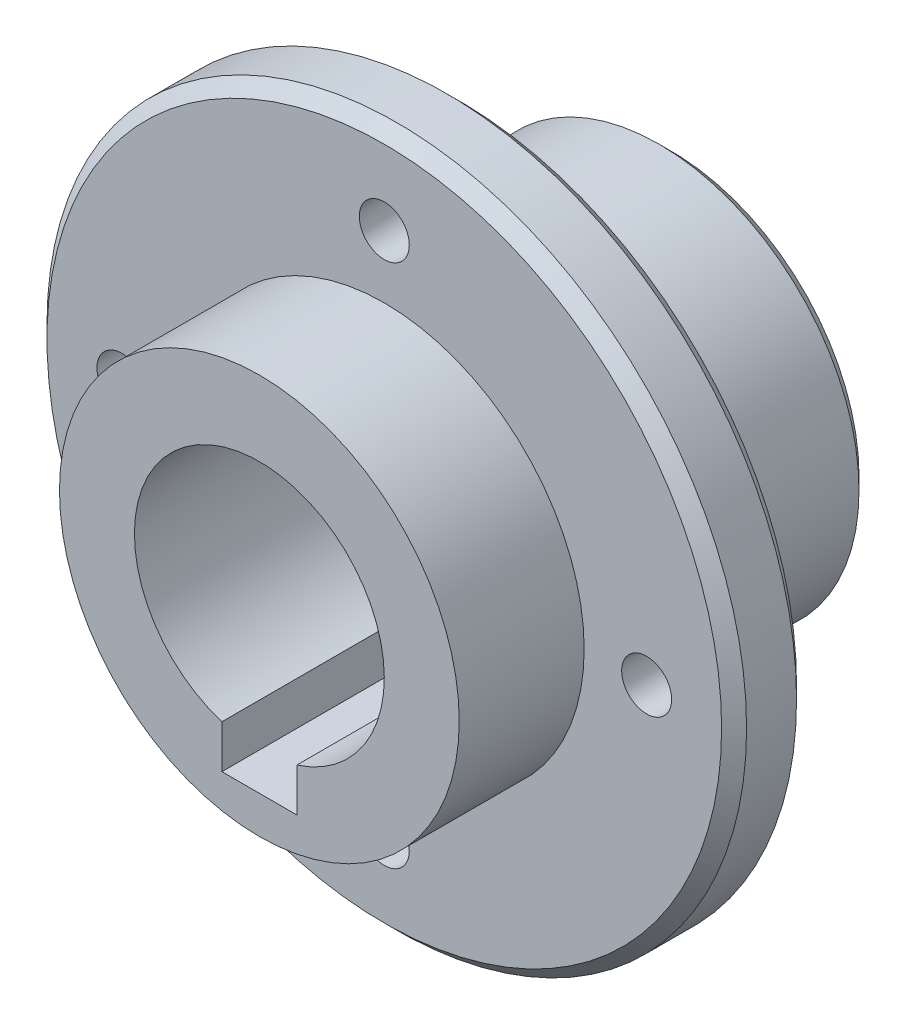
ISO-10303-21;
HEADER;
FILE_DESCRIPTION(('STEP AP214'),'2;1');
FILE_NAME('part.step','',(''),(''),'','','');
FILE_SCHEMA(('AUTOMOTIVE_DESIGN { 1 0 10303 214 1 1 1 1 }'));
ENDSEC;
DATA;
#1=APPLICATION_CONTEXT('core data for automotive mechanical design processes');
#2=APPLICATION_PROTOCOL_DEFINITION('international standard','automotive_design',2000,#1);
#3=PRODUCT_CONTEXT('',#1,'mechanical');
#4=PRODUCT('Part','Part','',(#3));
#5=PRODUCT_RELATED_PRODUCT_CATEGORY('part','',(#4));
#6=PRODUCT_DEFINITION_FORMATION('','',#4);
#7=PRODUCT_DEFINITION_CONTEXT('part definition',#1,'design');
#8=PRODUCT_DEFINITION('design','',#6,#7);
#9=PRODUCT_DEFINITION_SHAPE('','',#8);
#10=(LENGTH_UNIT() NAMED_UNIT(*) SI_UNIT(.MILLI.,.METRE.));
#11=(NAMED_UNIT(*) PLANE_ANGLE_UNIT() SI_UNIT($,.RADIAN.));
#12=(NAMED_UNIT(*) SI_UNIT($,.STERADIAN.) SOLID_ANGLE_UNIT());
#13=UNCERTAINTY_MEASURE_WITH_UNIT(LENGTH_MEASURE(1.E-05),#10,'distance_accuracy_value','');
#14=(GEOMETRIC_REPRESENTATION_CONTEXT(3) GLOBAL_UNCERTAINTY_ASSIGNED_CONTEXT((#13)) GLOBAL_UNIT_ASSIGNED_CONTEXT((#10,
#11,#12)) REPRESENTATION_CONTEXT('',''));
#15=CARTESIAN_POINT('',(0.,0.,0.));
#16=DIRECTION('',(0.,0.,1.));
#17=DIRECTION('',(1.,0.,0.));
#18=AXIS2_PLACEMENT_3D('',#15,#16,#17);
#19=CARTESIAN_POINT('',(0.,0.,23.));
#20=DIRECTION('',(0.,0.,1.));
#21=DIRECTION('',(1.,0.,0.));
#22=AXIS2_PLACEMENT_3D('',#19,#20,#21);
#23=PLANE('',#22);
#24=CARTESIAN_POINT('',(0.,21.,23.));
#25=DIRECTION('',(0.,0.,1.));
#26=DIRECTION('',(1.,0.,0.));
#27=AXIS2_PLACEMENT_3D('',#24,#25,#26);
#28=CIRCLE('',#27,2.);
#29=CARTESIAN_POINT('',(2.,21.,23.));
#30=VERTEX_POINT('',#29);
#31=EDGE_CURVE('E164',#30,#30,#28,.T.);
#32=ORIENTED_EDGE('',*,*,#31,.F.);
#33=EDGE_LOOP('',(#32));
#34=FACE_BOUND('',#33,.T.);
#35=CARTESIAN_POINT('',(21.,2.19963324347117E-13,23.));
#36=DIRECTION('',(0.,0.,1.));
#37=DIRECTION('',(1.,0.,0.));
#38=AXIS2_PLACEMENT_3D('',#35,#36,#37);
#39=CIRCLE('',#38,2.);
#40=CARTESIAN_POINT('',(23.,2.19963324347117E-13,23.));
#41=VERTEX_POINT('',#40);
#42=EDGE_CURVE('E139',#41,#41,#39,.T.);
#43=ORIENTED_EDGE('',*,*,#42,.F.);
#44=EDGE_LOOP('',(#43));
#45=FACE_BOUND('',#44,.T.);
#46=CARTESIAN_POINT('',(0.,-21.,23.));
#47=DIRECTION('',(0.,0.,1.));
#48=DIRECTION('',(1.,0.,0.));
#49=AXIS2_PLACEMENT_3D('',#46,#47,#48);
#50=CIRCLE('',#49,2.);
#51=CARTESIAN_POINT('',(2.,-21.,23.));
#52=VERTEX_POINT('',#51);
#53=EDGE_CURVE('E150',#52,#52,#50,.T.);
#54=ORIENTED_EDGE('',*,*,#53,.F.);
#55=EDGE_LOOP('',(#54));
#56=FACE_BOUND('',#55,.T.);
#57=CARTESIAN_POINT('',(-21.,0.,23.));
#58=DIRECTION('',(0.,0.,1.));
#59=DIRECTION('',(1.,0.,0.));
#60=AXIS2_PLACEMENT_3D('',#57,#58,#59);
#61=CIRCLE('',#60,2.);
#62=CARTESIAN_POINT('',(-19.,0.,23.));
#63=VERTEX_POINT('',#62);
#64=EDGE_CURVE('E154',#63,#63,#61,.T.);
#65=ORIENTED_EDGE('',*,*,#64,.F.);
#66=EDGE_LOOP('',(#65));
#67=FACE_BOUND('',#66,.T.);
#68=CARTESIAN_POINT('',(0.,0.,23.));
#69=DIRECTION('',(0.,0.,1.));
#70=DIRECTION('',(1.,0.,0.));
#71=AXIS2_PLACEMENT_3D('',#68,#69,#70);
#72=CIRCLE('',#71,27.);
#73=CARTESIAN_POINT('',(27.,0.,23.));
#74=VERTEX_POINT('',#73);
#75=EDGE_CURVE('E172',#74,#74,#72,.T.);
#76=ORIENTED_EDGE('',*,*,#75,.T.);
#77=EDGE_LOOP('',(#76));
#78=FACE_BOUND('',#77,.T.);
#79=CARTESIAN_POINT('',(0.,0.,23.));
#80=DIRECTION('',(0.,0.,1.));
#81=DIRECTION('',(1.,0.,0.));
#82=AXIS2_PLACEMENT_3D('',#79,#80,#81);
#83=CIRCLE('',#82,16.);
#84=CARTESIAN_POINT('',(16.,0.,23.));
#85=VERTEX_POINT('',#84);
#86=EDGE_CURVE('E126',#85,#85,#83,.T.);
#87=ORIENTED_EDGE('',*,*,#86,.F.);
#88=EDGE_LOOP('',(#87));
#89=FACE_BOUND('',#88,.T.);
#90=ADVANCED_FACE('F43',(#34,#45,#56,#67,#78,#89),#23,.T.);
#91=CARTESIAN_POINT('',(0.,0.,13.));
#92=DIRECTION('',(0.,0.,-1.));
#93=DIRECTION('',(-1.,0.,0.));
#94=AXIS2_PLACEMENT_3D('',#91,#92,#93);
#95=CYLINDRICAL_SURFACE('',#94,16.);
#96=CARTESIAN_POINT('',(0.,0.,1.00000000000004));
#97=DIRECTION('',(0.,0.,1.));
#98=DIRECTION('',(1.,0.,0.));
#99=AXIS2_PLACEMENT_3D('',#96,#97,#98);
#100=CIRCLE('',#99,16.);
#101=CARTESIAN_POINT('',(-16.,0.,1.00000000000004));
#102=VERTEX_POINT('',#101);
#103=EDGE_CURVE('E53',#102,#102,#100,.T.);
#104=CARTESIAN_POINT('',(0.,0.,17.));
#105=DIRECTION('',(0.,0.,1.));
#106=DIRECTION('',(1.,0.,0.));
#107=AXIS2_PLACEMENT_3D('',#104,#105,#106);
#108=CIRCLE('',#107,16.);
#109=CARTESIAN_POINT('',(-16.,0.,17.));
#110=VERTEX_POINT('',#109);
#111=EDGE_CURVE('E168',#110,#110,#108,.T.);
#112=CARTESIAN_POINT('',(-16.,0.,1.00000000000004));
#113=CARTESIAN_POINT('',(-16.,0.,1.16666666666671));
#114=CARTESIAN_POINT('',(-16.,0.,1.33333333333337));
#115=CARTESIAN_POINT('',(-16.,0.,1.6666666666667));
#116=CARTESIAN_POINT('',(-16.,0.,1.83333333333337));
#117=CARTESIAN_POINT('',(-16.,0.,2.1666666666667));
#118=CARTESIAN_POINT('',(-16.,0.,2.33333333333337));
#119=CARTESIAN_POINT('',(-16.,0.,2.6666666666667));
#120=CARTESIAN_POINT('',(-16.,0.,2.83333333333337));
#121=CARTESIAN_POINT('',(-16.,0.,3.1666666666667));
#122=CARTESIAN_POINT('',(-16.,0.,3.33333333333337));
#123=CARTESIAN_POINT('',(-16.,0.,3.6666666666667));
#124=CARTESIAN_POINT('',(-16.,0.,3.83333333333337));
#125=CARTESIAN_POINT('',(-16.,0.,4.1666666666667));
#126=CARTESIAN_POINT('',(-16.,0.,4.33333333333337));
#127=CARTESIAN_POINT('',(-16.,0.,4.6666666666667));
#128=CARTESIAN_POINT('',(-16.,0.,4.83333333333336));
#129=CARTESIAN_POINT('',(-16.,0.,5.1666666666667));
#130=CARTESIAN_POINT('',(-16.,0.,5.33333333333336));
#131=CARTESIAN_POINT('',(-16.,0.,5.66666666666669));
#132=CARTESIAN_POINT('',(-16.,0.,5.83333333333336));
#133=CARTESIAN_POINT('',(-16.,0.,6.16666666666669));
#134=CARTESIAN_POINT('',(-16.,0.,6.33333333333336));
#135=CARTESIAN_POINT('',(-16.,0.,6.66666666666669));
#136=CARTESIAN_POINT('',(-16.,0.,6.83333333333336));
#137=CARTESIAN_POINT('',(-16.,0.,7.16666666666669));
#138=CARTESIAN_POINT('',(-16.,0.,7.33333333333336));
#139=CARTESIAN_POINT('',(-16.,0.,7.66666666666669));
#140=CARTESIAN_POINT('',(-16.,0.,7.83333333333336));
#141=CARTESIAN_POINT('',(-16.,0.,8.16666666666669));
#142=CARTESIAN_POINT('',(-16.,0.,8.33333333333335));
#143=CARTESIAN_POINT('',(-16.,0.,8.66666666666669));
#144=CARTESIAN_POINT('',(-16.,0.,8.83333333333335));
#145=CARTESIAN_POINT('',(-16.,0.,9.16666666666668));
#146=CARTESIAN_POINT('',(-16.,0.,9.33333333333335));
#147=CARTESIAN_POINT('',(-16.,0.,9.66666666666668));
#148=CARTESIAN_POINT('',(-16.,0.,9.83333333333335));
#149=CARTESIAN_POINT('',(-16.,0.,10.1666666666667));
#150=CARTESIAN_POINT('',(-16.,0.,10.3333333333333));
#151=CARTESIAN_POINT('',(-16.,0.,10.6666666666667));
#152=CARTESIAN_POINT('',(-16.,0.,10.8333333333333));
#153=CARTESIAN_POINT('',(-16.,0.,11.1666666666667));
#154=CARTESIAN_POINT('',(-16.,0.,11.3333333333333));
#155=CARTESIAN_POINT('',(-16.,0.,11.6666666666667));
#156=CARTESIAN_POINT('',(-16.,0.,11.8333333333333));
#157=CARTESIAN_POINT('',(-16.,0.,12.1666666666667));
#158=CARTESIAN_POINT('',(-16.,0.,12.3333333333333));
#159=CARTESIAN_POINT('',(-16.,0.,12.6666666666667));
#160=CARTESIAN_POINT('',(-16.,0.,12.8333333333333));
#161=CARTESIAN_POINT('',(-16.,0.,13.1666666666667));
#162=CARTESIAN_POINT('',(-16.,0.,13.3333333333333));
#163=CARTESIAN_POINT('',(-16.,0.,13.6666666666667));
#164=CARTESIAN_POINT('',(-16.,0.,13.8333333333333));
#165=CARTESIAN_POINT('',(-16.,0.,14.1666666666667));
#166=CARTESIAN_POINT('',(-16.,0.,14.3333333333333));
#167=CARTESIAN_POINT('',(-16.,0.,14.6666666666667));
#168=CARTESIAN_POINT('',(-16.,0.,14.8333333333333));
#169=CARTESIAN_POINT('',(-16.,0.,15.1666666666667));
#170=CARTESIAN_POINT('',(-16.,0.,15.3333333333333));
#171=CARTESIAN_POINT('',(-16.,0.,15.6666666666667));
#172=CARTESIAN_POINT('',(-16.,0.,15.8333333333333));
#173=CARTESIAN_POINT('',(-16.,0.,16.1666666666667));
#174=CARTESIAN_POINT('',(-16.,0.,16.3333333333333));
#175=CARTESIAN_POINT('',(-16.,0.,16.6666666666667));
#176=CARTESIAN_POINT('',(-16.,0.,16.8333333333333));
#177=CARTESIAN_POINT('',(-16.,0.,17.));
#178=B_SPLINE_CURVE_WITH_KNOTS('',3,(#112,#113,#114,#115,#116,#117,#118,#119,#120,#121,#122,
#123,#124,#125,#126,#127,#128,#129,#130,#131,#132,#133,#134,#135,#136,#137,#138,#139,#140,#141,
#142,#143,#144,#145,#146,#147,#148,#149,#150,#151,#152,#153,#154,#155,#156,#157,#158,#159,#160,
#161,#162,#163,#164,#165,#166,#167,#168,#169,#170,#171,#172,#173,#174,#175,#176,#177),
.UNSPECIFIED.,.F.,.F.,(4,2,2,2,2,2,2,2,2,2,2,2,2,2,2,2,2,2,2,2,2,2,2,2,2,2,2,2,2,2,2,2,4),(0.,
0.499999999999999,0.999999999999997,1.5,1.99999999999999,2.49999999999999,2.99999999999999,
3.49999999999999,3.99999999999999,4.49999999999999,4.99999999999999,5.49999999999999,
5.99999999999999,6.49999999999998,6.99999999999998,7.49999999999998,7.99999999999998,
8.49999999999998,8.99999999999998,9.49999999999998,9.99999999999997,10.5,11.,11.5,12.,12.5,13.,
13.5,14.,14.5,15.,15.5,16.),.UNSPECIFIED.);
#179=EDGE_CURVE('BSEAM191',#102,#110,#178,.T.);
#180=ORIENTED_EDGE('',*,*,#103,.T.);
#181=ORIENTED_EDGE('',*,*,#111,.F.);
#182=ORIENTED_EDGE('',*,*,#179,.T.);
#183=ORIENTED_EDGE('',*,*,#179,.F.);
#184=EDGE_LOOP('',(#180,#182,#181,#183));
#185=FACE_BOUND('',#184,.T.);
#186=ADVANCED_FACE('F191',(#185),#95,.T.);
#187=CARTESIAN_POINT('',(0.,0.,0.));
#188=DIRECTION('',(0.,0.,1.));
#189=DIRECTION('',(1.,0.,0.));
#190=AXIS2_PLACEMENT_3D('',#187,#188,#189);
#191=PLANE('',#190);
#192=CARTESIAN_POINT('',(0.,0.,0.));
#193=DIRECTION('',(0.,0.,1.));
#194=DIRECTION('',(1.,0.,0.));
#195=AXIS2_PLACEMENT_3D('',#192,#193,#194);
#196=CIRCLE('',#195,15.);
#197=CARTESIAN_POINT('',(15.,0.,0.));
#198=VERTEX_POINT('',#197);
#199=EDGE_CURVE('E11',#198,#198,#196,.F.);
#200=ORIENTED_EDGE('',*,*,#199,.T.);
#201=EDGE_LOOP('',(#200));
#202=FACE_BOUND('',#201,.T.);
#203=DIRECTION('',(-1.,0.,0.));
#204=VECTOR('',#203,1.);
#205=CARTESIAN_POINT('',(0.,-13.,0.));
#206=LINE('',#205,#204);
#207=CARTESIAN_POINT('',(3.,-13.,0.));
#208=VERTEX_POINT('',#207);
#209=CARTESIAN_POINT('',(-3.,-13.,0.));
#210=VERTEX_POINT('',#209);
#211=EDGE_CURVE('E85',#208,#210,#206,.T.);
#212=ORIENTED_EDGE('',*,*,#211,.F.);
#213=DIRECTION('',(0.,1.,0.));
#214=VECTOR('',#213,1.);
#215=CARTESIAN_POINT('',(3.,-13.,0.));
#216=LINE('',#215,#214);
#217=CARTESIAN_POINT('',(3.,-9.53939201416946,0.));
#218=VERTEX_POINT('',#217);
#219=EDGE_CURVE('E119',#208,#218,#216,.T.);
#220=ORIENTED_EDGE('',*,*,#219,.T.);
#221=CARTESIAN_POINT('',(0.,0.,0.));
#222=DIRECTION('',(0.,0.,-1.));
#223=DIRECTION('',(-1.,0.,0.));
#224=AXIS2_PLACEMENT_3D('',#221,#222,#223);
#225=CIRCLE('',#224,10.);
#226=CARTESIAN_POINT('',(-3.,-9.53939201416946,0.));
#227=VERTEX_POINT('',#226);
#228=EDGE_CURVE('E106',#227,#218,#225,.T.);
#229=ORIENTED_EDGE('',*,*,#228,.F.);
#230=DIRECTION('',(0.,1.,0.));
#231=VECTOR('',#230,1.);
#232=CARTESIAN_POINT('',(-3.,-13.,0.));
#233=LINE('',#232,#231);
#234=EDGE_CURVE('E95',#210,#227,#233,.T.);
#235=ORIENTED_EDGE('',*,*,#234,.F.);
#236=EDGE_LOOP('',(#212,#220,#229,#235));
#237=FACE_BOUND('',#236,.T.);
#238=ADVANCED_FACE('F104',(#202,#237),#191,.F.);
#239=CARTESIAN_POINT('',(0.,0.,23.));
#240=DIRECTION('',(0.,0.,-1.));
#241=DIRECTION('',(-1.,0.,0.));
#242=AXIS2_PLACEMENT_3D('',#239,#240,#241);
#243=CYLINDRICAL_SURFACE('',#242,28.);
#244=CARTESIAN_POINT('',(0.,0.,18.));
#245=DIRECTION('',(0.,0.,1.));
#246=DIRECTION('',(1.,0.,0.));
#247=AXIS2_PLACEMENT_3D('',#244,#245,#246);
#248=CIRCLE('',#247,28.);
#249=CARTESIAN_POINT('',(28.,0.,18.));
#250=VERTEX_POINT('',#249);
#251=EDGE_CURVE('E180',#250,#250,#248,.T.);
#252=ORIENTED_EDGE('',*,*,#251,.T.);
#253=EDGE_LOOP('',(#252));
#254=FACE_BOUND('',#253,.T.);
#255=CARTESIAN_POINT('',(0.,0.,22.));
#256=DIRECTION('',(0.,0.,1.));
#257=DIRECTION('',(1.,0.,0.));
#258=AXIS2_PLACEMENT_3D('',#255,#256,#257);
#259=CIRCLE('',#258,28.);
#260=CARTESIAN_POINT('',(28.,0.,22.));
#261=VERTEX_POINT('',#260);
#262=EDGE_CURVE('E176',#261,#261,#259,.F.);
#263=ORIENTED_EDGE('',*,*,#262,.T.);
#264=EDGE_LOOP('',(#263));
#265=FACE_BOUND('',#264,.T.);
#266=ADVANCED_FACE('F224',(#254,#265),#243,.T.);
#267=CARTESIAN_POINT('',(0.,0.,17.));
#268=DIRECTION('',(0.,0.,1.));
#269=DIRECTION('',(1.,0.,0.));
#270=AXIS2_PLACEMENT_3D('',#267,#268,#269);
#271=PLANE('',#270);
#272=CARTESIAN_POINT('',(0.,0.,17.));
#273=DIRECTION('',(0.,0.,1.));
#274=DIRECTION('',(1.,0.,0.));
#275=AXIS2_PLACEMENT_3D('',#272,#273,#274);
#276=CIRCLE('',#275,27.);
#277=CARTESIAN_POINT('',(27.,0.,17.));
#278=VERTEX_POINT('',#277);
#279=EDGE_CURVE('E184',#278,#278,#276,.F.);
#280=ORIENTED_EDGE('',*,*,#279,.T.);
#281=EDGE_LOOP('',(#280));
#282=FACE_BOUND('',#281,.T.);
#283=CARTESIAN_POINT('',(-21.,0.,17.));
#284=DIRECTION('',(0.,0.,-1.));
#285=DIRECTION('',(0.,-1.,0.));
#286=AXIS2_PLACEMENT_3D('',#283,#284,#285);
#287=CIRCLE('',#286,2.);
#288=CARTESIAN_POINT('',(-21.,-2.00000000000008,17.));
#289=VERTEX_POINT('',#288);
#290=EDGE_CURVE('E135',#289,#289,#287,.T.);
#291=ORIENTED_EDGE('',*,*,#290,.F.);
#292=EDGE_LOOP('',(#291));
#293=FACE_BOUND('',#292,.T.);
#294=CARTESIAN_POINT('',(0.,-21.,17.));
#295=DIRECTION('',(0.,0.,-1.));
#296=DIRECTION('',(1.,0.,0.));
#297=AXIS2_PLACEMENT_3D('',#294,#295,#296);
#298=CIRCLE('',#297,2.);
#299=CARTESIAN_POINT('',(2.,-21.,17.));
#300=VERTEX_POINT('',#299);
#301=EDGE_CURVE('E140',#300,#300,#298,.T.);
#302=ORIENTED_EDGE('',*,*,#301,.F.);
#303=EDGE_LOOP('',(#302));
#304=FACE_BOUND('',#303,.T.);
#305=CARTESIAN_POINT('',(21.,2.19963324347117E-13,17.));
#306=DIRECTION('',(0.,0.,-1.));
#307=DIRECTION('',(0.,1.,0.));
#308=AXIS2_PLACEMENT_3D('',#305,#306,#307);
#309=CIRCLE('',#308,2.);
#310=CARTESIAN_POINT('',(21.,2.00000000000022,17.));
#311=VERTEX_POINT('',#310);
#312=EDGE_CURVE('E131',#311,#311,#309,.T.);
#313=ORIENTED_EDGE('',*,*,#312,.F.);
#314=EDGE_LOOP('',(#313));
#315=FACE_BOUND('',#314,.T.);
#316=CARTESIAN_POINT('',(0.,21.,17.));
#317=DIRECTION('',(0.,0.,-1.));
#318=DIRECTION('',(-1.,0.,0.));
#319=AXIS2_PLACEMENT_3D('',#316,#317,#318);
#320=CIRCLE('',#319,2.);
#321=CARTESIAN_POINT('',(-2.,21.,17.));
#322=VERTEX_POINT('',#321);
#323=EDGE_CURVE('E160',#322,#322,#320,.T.);
#324=ORIENTED_EDGE('',*,*,#323,.F.);
#325=EDGE_LOOP('',(#324));
#326=FACE_BOUND('',#325,.T.);
#327=ORIENTED_EDGE('',*,*,#111,.T.);
#328=EDGE_LOOP('',(#327));
#329=FACE_BOUND('',#328,.T.);
#330=ADVANCED_FACE('F221',(#282,#293,#304,#315,#326,#329),#271,.F.);
#331=CARTESIAN_POINT('',(0.,21.,27.));
#332=DIRECTION('',(0.,0.,-1.));
#333=DIRECTION('',(-1.,0.,0.));
#334=AXIS2_PLACEMENT_3D('',#331,#332,#333);
#335=CYLINDRICAL_SURFACE('',#334,2.);
#336=ORIENTED_EDGE('',*,*,#31,.T.);
#337=EDGE_LOOP('',(#336));
#338=FACE_BOUND('',#337,.T.);
#339=ORIENTED_EDGE('',*,*,#323,.T.);
#340=EDGE_LOOP('',(#339));
#341=FACE_BOUND('',#340,.T.);
#342=ADVANCED_FACE('F219',(#338,#341),#335,.F.);
#343=CARTESIAN_POINT('',(0.,0.,60.));
#344=DIRECTION('',(0.,0.,-1.));
#345=DIRECTION('',(-1.,0.,0.));
#346=AXIS2_PLACEMENT_3D('',#343,#344,#345);
#347=CYLINDRICAL_SURFACE('',#346,10.);
#348=ORIENTED_EDGE('',*,*,#228,.T.);
#349=DIRECTION('',(0.,0.,-1.));
#350=VECTOR('',#349,1.);
#351=CARTESIAN_POINT('',(3.,-9.53939201416945,60.));
#352=LINE('',#351,#350);
#353=CARTESIAN_POINT('',(3.,-9.53939201416946,33.));
#354=VERTEX_POINT('',#353);
#355=EDGE_CURVE('E68',#218,#354,#352,.F.);
#356=ORIENTED_EDGE('',*,*,#355,.T.);
#357=CARTESIAN_POINT('',(0.,0.,33.));
#358=DIRECTION('',(0.,0.,1.));
#359=DIRECTION('',(1.,0.,0.));
#360=AXIS2_PLACEMENT_3D('',#357,#358,#359);
#361=CIRCLE('',#360,10.);
#362=CARTESIAN_POINT('',(-3.,-9.53939201416946,33.));
#363=VERTEX_POINT('',#362);
#364=EDGE_CURVE('E122',#354,#363,#361,.T.);
#365=ORIENTED_EDGE('',*,*,#364,.T.);
#366=DIRECTION('',(0.,0.,-1.));
#367=VECTOR('',#366,1.);
#368=CARTESIAN_POINT('',(-2.99999999999999,-9.53939201416946,60.));
#369=LINE('',#368,#367);
#370=EDGE_CURVE('E116',#363,#227,#369,.T.);
#371=ORIENTED_EDGE('',*,*,#370,.T.);
#372=EDGE_LOOP('',(#348,#356,#365,#371));
#373=FACE_BOUND('',#372,.T.);
#374=ADVANCED_FACE('F272',(#373),#347,.F.);
#375=CARTESIAN_POINT('',(21.,2.19963324347117E-13,27.));
#376=DIRECTION('',(0.,0.,-1.));
#377=DIRECTION('',(-1.,0.,0.));
#378=AXIS2_PLACEMENT_3D('',#375,#376,#377);
#379=CYLINDRICAL_SURFACE('',#378,2.);
#380=ORIENTED_EDGE('',*,*,#42,.T.);
#381=EDGE_LOOP('',(#380));
#382=FACE_BOUND('',#381,.T.);
#383=ORIENTED_EDGE('',*,*,#312,.T.);
#384=EDGE_LOOP('',(#383));
#385=FACE_BOUND('',#384,.T.);
#386=ADVANCED_FACE('F269',(#382,#385),#379,.F.);
#387=CARTESIAN_POINT('',(0.,-21.,27.));
#388=DIRECTION('',(0.,0.,-1.));
#389=DIRECTION('',(-1.,0.,0.));
#390=AXIS2_PLACEMENT_3D('',#387,#388,#389);
#391=CYLINDRICAL_SURFACE('',#390,2.);
#392=ORIENTED_EDGE('',*,*,#53,.T.);
#393=EDGE_LOOP('',(#392));
#394=FACE_BOUND('',#393,.T.);
#395=ORIENTED_EDGE('',*,*,#301,.T.);
#396=EDGE_LOOP('',(#395));
#397=FACE_BOUND('',#396,.T.);
#398=ADVANCED_FACE('F246',(#394,#397),#391,.F.);
#399=CARTESIAN_POINT('',(-21.,0.,27.));
#400=DIRECTION('',(0.,0.,-1.));
#401=DIRECTION('',(-1.,0.,0.));
#402=AXIS2_PLACEMENT_3D('',#399,#400,#401);
#403=CYLINDRICAL_SURFACE('',#402,2.);
#404=ORIENTED_EDGE('',*,*,#64,.T.);
#405=EDGE_LOOP('',(#404));
#406=FACE_BOUND('',#405,.T.);
#407=ORIENTED_EDGE('',*,*,#290,.T.);
#408=EDGE_LOOP('',(#407));
#409=FACE_BOUND('',#408,.T.);
#410=ADVANCED_FACE('F237',(#406,#409),#403,.F.);
#411=CARTESIAN_POINT('',(0.,0.,23.));
#412=DIRECTION('',(0.,0.,-1.));
#413=DIRECTION('',(-1.,0.,0.));
#414=AXIS2_PLACEMENT_3D('',#411,#412,#413);
#415=CONICAL_SURFACE('',#414,27.,0.785398163397452);
#416=ORIENTED_EDGE('',*,*,#262,.F.);
#417=EDGE_LOOP('',(#416));
#418=FACE_BOUND('',#417,.T.);
#419=ORIENTED_EDGE('',*,*,#75,.F.);
#420=EDGE_LOOP('',(#419));
#421=FACE_BOUND('',#420,.T.);
#422=ADVANCED_FACE('F205',(#418,#421),#415,.T.);
#423=CARTESIAN_POINT('',(0.,0.,18.));
#424=DIRECTION('',(0.,0.,1.));
#425=DIRECTION('',(1.,0.,0.));
#426=AXIS2_PLACEMENT_3D('',#423,#424,#425);
#427=CONICAL_SURFACE('',#426,28.,0.785398163397452);
#428=ORIENTED_EDGE('',*,*,#279,.F.);
#429=EDGE_LOOP('',(#428));
#430=FACE_BOUND('',#429,.T.);
#431=ORIENTED_EDGE('',*,*,#251,.F.);
#432=EDGE_LOOP('',(#431));
#433=FACE_BOUND('',#432,.T.);
#434=ADVANCED_FACE('F196',(#430,#433),#427,.T.);
#435=CARTESIAN_POINT('',(0.,0.,1.00000000000004));
#436=DIRECTION('',(0.,0.,1.));
#437=DIRECTION('',(1.,0.,0.));
#438=AXIS2_PLACEMENT_3D('',#435,#436,#437);
#439=CONICAL_SURFACE('',#438,16.,0.785398163397452);
#440=ORIENTED_EDGE('',*,*,#199,.F.);
#441=EDGE_LOOP('',(#440));
#442=FACE_BOUND('',#441,.T.);
#443=ORIENTED_EDGE('',*,*,#103,.F.);
#444=EDGE_LOOP('',(#443));
#445=FACE_BOUND('',#444,.T.);
#446=ADVANCED_FACE('F46',(#442,#445),#439,.T.);
#447=CARTESIAN_POINT('',(0.,0.,33.));
#448=DIRECTION('',(0.,0.,1.));
#449=DIRECTION('',(1.,0.,0.));
#450=AXIS2_PLACEMENT_3D('',#447,#448,#449);
#451=PLANE('',#450);
#452=DIRECTION('',(0.,1.,0.));
#453=VECTOR('',#452,1.);
#454=CARTESIAN_POINT('',(3.,-13.,33.));
#455=LINE('',#454,#453);
#456=CARTESIAN_POINT('',(3.,-13.,33.));
#457=VERTEX_POINT('',#456);
#458=EDGE_CURVE('E111',#457,#354,#455,.T.);
#459=ORIENTED_EDGE('',*,*,#458,.F.);
#460=DIRECTION('',(1.,0.,0.));
#461=VECTOR('',#460,1.);
#462=CARTESIAN_POINT('',(3.,-13.,33.));
#463=LINE('',#462,#461);
#464=CARTESIAN_POINT('',(-3.,-13.,33.));
#465=VERTEX_POINT('',#464);
#466=EDGE_CURVE('E101',#465,#457,#463,.T.);
#467=ORIENTED_EDGE('',*,*,#466,.F.);
#468=DIRECTION('',(0.,1.,0.));
#469=VECTOR('',#468,1.);
#470=CARTESIAN_POINT('',(-3.,-13.,33.));
#471=LINE('',#470,#469);
#472=EDGE_CURVE('E98',#465,#363,#471,.T.);
#473=ORIENTED_EDGE('',*,*,#472,.T.);
#474=ORIENTED_EDGE('',*,*,#364,.F.);
#475=EDGE_LOOP('',(#459,#467,#473,#474));
#476=FACE_BOUND('',#475,.T.);
#477=CARTESIAN_POINT('',(0.,0.,33.));
#478=DIRECTION('',(0.,0.,1.));
#479=DIRECTION('',(1.,0.,0.));
#480=AXIS2_PLACEMENT_3D('',#477,#478,#479);
#481=CIRCLE('',#480,16.);
#482=CARTESIAN_POINT('',(16.,0.,33.));
#483=VERTEX_POINT('',#482);
#484=EDGE_CURVE('E127',#483,#483,#481,.T.);
#485=ORIENTED_EDGE('',*,*,#484,.T.);
#486=EDGE_LOOP('',(#485));
#487=FACE_BOUND('',#486,.T.);
#488=ADVANCED_FACE('F195',(#476,#487),#451,.T.);
#489=CARTESIAN_POINT('',(0.,0.,33.));
#490=DIRECTION('',(0.,0.,-1.));
#491=DIRECTION('',(-1.,0.,0.));
#492=AXIS2_PLACEMENT_3D('',#489,#490,#491);
#493=CYLINDRICAL_SURFACE('',#492,16.);
#494=ORIENTED_EDGE('',*,*,#484,.F.);
#495=EDGE_LOOP('',(#494));
#496=FACE_BOUND('',#495,.T.);
#497=ORIENTED_EDGE('',*,*,#86,.T.);
#498=EDGE_LOOP('',(#497));
#499=FACE_BOUND('',#498,.T.);
#500=ADVANCED_FACE('F202',(#496,#499),#493,.T.);
#501=CARTESIAN_POINT('',(3.,-13.,0.));
#502=DIRECTION('',(1.,0.,0.));
#503=DIRECTION('',(0.,0.,-1.));
#504=AXIS2_PLACEMENT_3D('',#501,#502,#503);
#505=PLANE('',#504);
#506=ORIENTED_EDGE('',*,*,#219,.F.);
#507=DIRECTION('',(0.,0.,-1.));
#508=VECTOR('',#507,1.);
#509=CARTESIAN_POINT('',(3.,-13.,0.));
#510=LINE('',#509,#508);
#511=EDGE_CURVE('E88',#457,#208,#510,.T.);
#512=ORIENTED_EDGE('',*,*,#511,.F.);
#513=ORIENTED_EDGE('',*,*,#458,.T.);
#514=ORIENTED_EDGE('',*,*,#355,.F.);
#515=EDGE_LOOP('',(#506,#512,#513,#514));
#516=FACE_BOUND('',#515,.T.);
#517=ADVANCED_FACE('F257',(#516),#505,.F.);
#518=CARTESIAN_POINT('',(-3.,-13.,0.));
#519=DIRECTION('',(-1.,0.,0.));
#520=DIRECTION('',(0.,0.,1.));
#521=AXIS2_PLACEMENT_3D('',#518,#519,#520);
#522=PLANE('',#521);
#523=ORIENTED_EDGE('',*,*,#472,.F.);
#524=DIRECTION('',(0.,0.,1.));
#525=VECTOR('',#524,1.);
#526=CARTESIAN_POINT('',(-3.,-13.,0.));
#527=LINE('',#526,#525);
#528=EDGE_CURVE('E60',#210,#465,#527,.T.);
#529=ORIENTED_EDGE('',*,*,#528,.F.);
#530=ORIENTED_EDGE('',*,*,#234,.T.);
#531=ORIENTED_EDGE('',*,*,#370,.F.);
#532=EDGE_LOOP('',(#523,#529,#530,#531));
#533=FACE_BOUND('',#532,.T.);
#534=ADVANCED_FACE('F94',(#533),#522,.F.);
#535=CARTESIAN_POINT('',(0.,-13.,0.));
#536=DIRECTION('',(0.,-1.,0.));
#537=DIRECTION('',(0.,0.,-1.));
#538=AXIS2_PLACEMENT_3D('',#535,#536,#537);
#539=PLANE('',#538);
#540=ORIENTED_EDGE('',*,*,#211,.T.);
#541=ORIENTED_EDGE('',*,*,#528,.T.);
#542=ORIENTED_EDGE('',*,*,#466,.T.);
#543=ORIENTED_EDGE('',*,*,#511,.T.);
#544=EDGE_LOOP('',(#540,#541,#542,#543));
#545=FACE_BOUND('',#544,.T.);
#546=ADVANCED_FACE('F86',(#545),#539,.F.);
#547=CLOSED_SHELL('',(#90,#186,#238,#266,#330,#342,#374,#386,#398,#410,#422,#434,#446,#488,#500,
#517,#534,#546));
#548=MANIFOLD_SOLID_BREP('B2',#547);
#549=ADVANCED_BREP_SHAPE_REPRESENTATION('',(#18,#548),#14);
#550=SHAPE_DEFINITION_REPRESENTATION(#9,#549);
ENDSEC;
END-ISO-10303-21;
